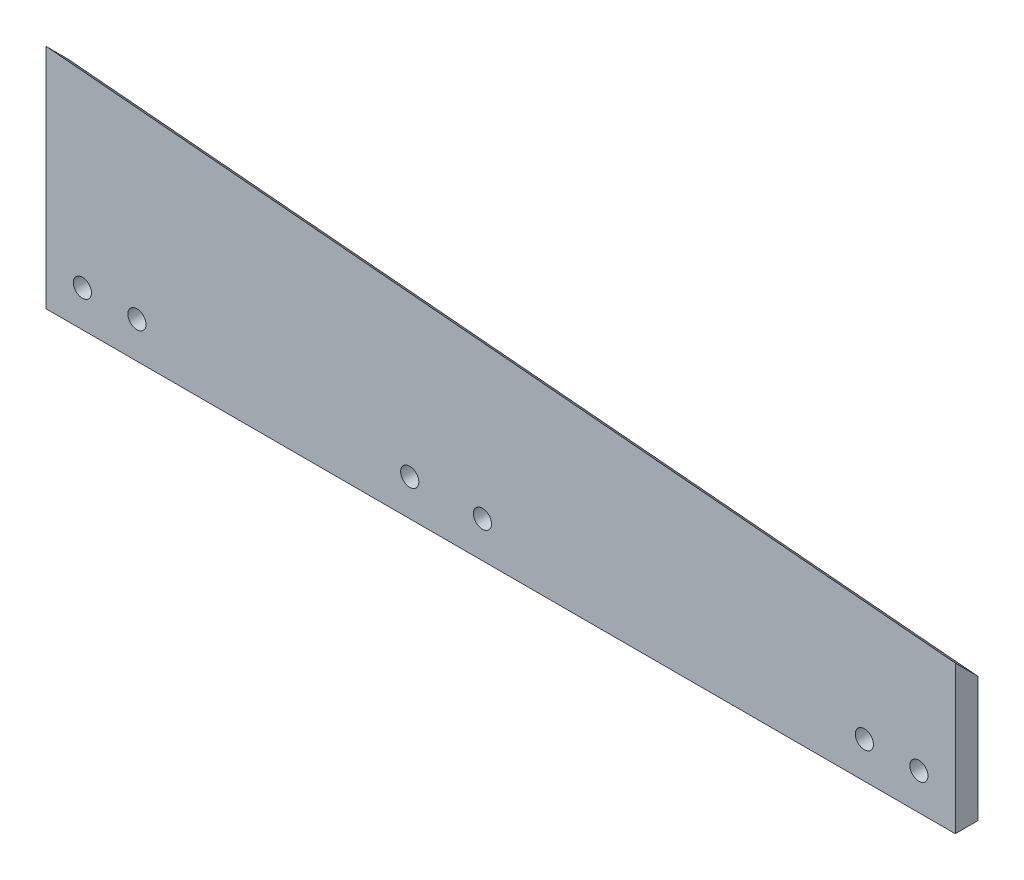
ISO-10303-21;
HEADER;
FILE_DESCRIPTION(('STEP AP214'),'2;1');
FILE_NAME('part.step','',(''),(''),'','','');
FILE_SCHEMA(('AUTOMOTIVE_DESIGN { 1 0 10303 214 1 1 1 1 }'));
ENDSEC;
DATA;
#1=APPLICATION_CONTEXT('core data for automotive mechanical design processes');
#2=APPLICATION_PROTOCOL_DEFINITION('international standard','automotive_design',2000,#1);
#3=PRODUCT_CONTEXT('',#1,'mechanical');
#4=PRODUCT('Part','Part','',(#3));
#5=PRODUCT_RELATED_PRODUCT_CATEGORY('part','',(#4));
#6=PRODUCT_DEFINITION_FORMATION('','',#4);
#7=PRODUCT_DEFINITION_CONTEXT('part definition',#1,'design');
#8=PRODUCT_DEFINITION('design','',#6,#7);
#9=PRODUCT_DEFINITION_SHAPE('','',#8);
#10=(LENGTH_UNIT() NAMED_UNIT(*) SI_UNIT(.MILLI.,.METRE.));
#11=(NAMED_UNIT(*) PLANE_ANGLE_UNIT() SI_UNIT($,.RADIAN.));
#12=(NAMED_UNIT(*) SI_UNIT($,.STERADIAN.) SOLID_ANGLE_UNIT());
#13=UNCERTAINTY_MEASURE_WITH_UNIT(LENGTH_MEASURE(1.E-05),#10,'distance_accuracy_value','');
#14=(GEOMETRIC_REPRESENTATION_CONTEXT(3) GLOBAL_UNCERTAINTY_ASSIGNED_CONTEXT((#13)) GLOBAL_UNIT_ASSIGNED_CONTEXT((#10,
#11,#12)) REPRESENTATION_CONTEXT('',''));
#15=CARTESIAN_POINT('',(0.,0.,0.));
#16=DIRECTION('',(0.,0.,1.));
#17=DIRECTION('',(1.,0.,0.));
#18=AXIS2_PLACEMENT_3D('',#15,#16,#17);
#19=CARTESIAN_POINT('',(200.,50.,5.));
#20=DIRECTION('',(0.,0.,-1.));
#21=DIRECTION('',(0.,1.,0.));
#22=AXIS2_PLACEMENT_3D('',#19,#20,#21);
#23=PLANE('',#22);
#24=CARTESIAN_POINT('',(80.,8.,5.));
#25=DIRECTION('',(0.,0.,-1.));
#26=DIRECTION('',(0.,1.,0.));
#27=AXIS2_PLACEMENT_3D('',#24,#25,#26);
#28=CIRCLE('',#27,2.);
#29=CARTESIAN_POINT('',(80.,10.,5.));
#30=VERTEX_POINT('',#29);
#31=EDGE_CURVE('E134',#30,#30,#28,.F.);
#32=ORIENTED_EDGE('',*,*,#31,.F.);
#33=EDGE_LOOP('',(#32));
#34=FACE_BOUND('',#33,.T.);
#35=CARTESIAN_POINT('',(96.,8.,5.));
#36=DIRECTION('',(0.,0.,-1.));
#37=DIRECTION('',(0.,1.,0.));
#38=AXIS2_PLACEMENT_3D('',#35,#36,#37);
#39=CIRCLE('',#38,2.);
#40=CARTESIAN_POINT('',(96.,10.,5.));
#41=VERTEX_POINT('',#40);
#42=EDGE_CURVE('E138',#41,#41,#39,.F.);
#43=ORIENTED_EDGE('',*,*,#42,.F.);
#44=EDGE_LOOP('',(#43));
#45=FACE_BOUND('',#44,.T.);
#46=CARTESIAN_POINT('',(8.00000000000001,8.,5.));
#47=DIRECTION('',(0.,0.,-1.));
#48=DIRECTION('',(0.,1.,0.));
#49=AXIS2_PLACEMENT_3D('',#46,#47,#48);
#50=CIRCLE('',#49,2.);
#51=CARTESIAN_POINT('',(8.00000000000001,10.,5.));
#52=VERTEX_POINT('',#51);
#53=EDGE_CURVE('E142',#52,#52,#50,.T.);
#54=ORIENTED_EDGE('',*,*,#53,.T.);
#55=EDGE_LOOP('',(#54));
#56=FACE_BOUND('',#55,.T.);
#57=CARTESIAN_POINT('',(20.,8.,5.));
#58=DIRECTION('',(0.,0.,-1.));
#59=DIRECTION('',(0.,1.,0.));
#60=AXIS2_PLACEMENT_3D('',#57,#58,#59);
#61=CIRCLE('',#60,2.);
#62=CARTESIAN_POINT('',(20.,10.,5.));
#63=VERTEX_POINT('',#62);
#64=EDGE_CURVE('E146',#63,#63,#61,.T.);
#65=ORIENTED_EDGE('',*,*,#64,.T.);
#66=EDGE_LOOP('',(#65));
#67=FACE_BOUND('',#66,.T.);
#68=CARTESIAN_POINT('',(192.,8.,5.));
#69=DIRECTION('',(0.,0.,-1.));
#70=DIRECTION('',(0.,1.,0.));
#71=AXIS2_PLACEMENT_3D('',#68,#69,#70);
#72=CIRCLE('',#71,2.);
#73=CARTESIAN_POINT('',(192.,10.,5.));
#74=VERTEX_POINT('',#73);
#75=EDGE_CURVE('E91',#74,#74,#72,.F.);
#76=ORIENTED_EDGE('',*,*,#75,.F.);
#77=EDGE_LOOP('',(#76));
#78=FACE_BOUND('',#77,.T.);
#79=CARTESIAN_POINT('',(180.,8.,5.));
#80=DIRECTION('',(0.,0.,-1.));
#81=DIRECTION('',(0.,1.,0.));
#82=AXIS2_PLACEMENT_3D('',#79,#80,#81);
#83=CIRCLE('',#82,2.);
#84=CARTESIAN_POINT('',(180.,10.,5.));
#85=VERTEX_POINT('',#84);
#86=EDGE_CURVE('E99',#85,#85,#83,.F.);
#87=ORIENTED_EDGE('',*,*,#86,.F.);
#88=EDGE_LOOP('',(#87));
#89=FACE_BOUND('',#88,.T.);
#90=DIRECTION('',(0.,-1.,0.));
#91=VECTOR('',#90,1.);
#92=CARTESIAN_POINT('',(200.,50.,5.));
#93=LINE('',#92,#91);
#94=CARTESIAN_POINT('',(200.,32.5022672948167,5.));
#95=VERTEX_POINT('',#94);
#96=CARTESIAN_POINT('',(200.,0.,5.));
#97=VERTEX_POINT('',#96);
#98=EDGE_CURVE('E75',#95,#97,#93,.T.);
#99=ORIENTED_EDGE('',*,*,#98,.F.);
#100=DIRECTION('',(0.996194698091746,-0.0871557427476508,0.));
#101=VECTOR('',#100,1.);
#102=CARTESIAN_POINT('',(200.,32.5022672948167,5.));
#103=LINE('',#102,#101);
#104=CARTESIAN_POINT('',(0.,50.,5.));
#105=VERTEX_POINT('',#104);
#106=EDGE_CURVE('E84',#105,#95,#103,.T.);
#107=ORIENTED_EDGE('',*,*,#106,.F.);
#108=DIRECTION('',(0.,-1.,0.));
#109=VECTOR('',#108,1.);
#110=CARTESIAN_POINT('',(0.,50.,5.));
#111=LINE('',#110,#109);
#112=CARTESIAN_POINT('',(0.,0.,5.));
#113=VERTEX_POINT('',#112);
#114=EDGE_CURVE('E90',#105,#113,#111,.T.);
#115=ORIENTED_EDGE('',*,*,#114,.T.);
#116=DIRECTION('',(-1.,0.,0.));
#117=VECTOR('',#116,1.);
#118=CARTESIAN_POINT('',(200.,0.,5.));
#119=LINE('',#118,#117);
#120=EDGE_CURVE('E86',#97,#113,#119,.T.);
#121=ORIENTED_EDGE('',*,*,#120,.F.);
#122=EDGE_LOOP('',(#99,#107,#115,#121));
#123=FACE_BOUND('',#122,.T.);
#124=ADVANCED_FACE('F33',(#34,#45,#56,#67,#78,#89,#123),#23,.F.);
#125=CARTESIAN_POINT('',(200.,0.,5.));
#126=DIRECTION('',(0.,1.,0.));
#127=DIRECTION('',(0.,0.,1.));
#128=AXIS2_PLACEMENT_3D('',#125,#126,#127);
#129=PLANE('',#128);
#130=DIRECTION('',(0.,0.,-1.));
#131=VECTOR('',#130,1.);
#132=CARTESIAN_POINT('',(0.,0.,5.));
#133=LINE('',#132,#131);
#134=CARTESIAN_POINT('',(0.,0.,0.));
#135=VERTEX_POINT('',#134);
#136=EDGE_CURVE('E93',#113,#135,#133,.T.);
#137=ORIENTED_EDGE('',*,*,#136,.T.);
#138=DIRECTION('',(-1.,0.,0.));
#139=VECTOR('',#138,1.);
#140=CARTESIAN_POINT('',(200.,0.,0.));
#141=LINE('',#140,#139);
#142=CARTESIAN_POINT('',(200.,0.,0.));
#143=VERTEX_POINT('',#142);
#144=EDGE_CURVE('E103',#143,#135,#141,.T.);
#145=ORIENTED_EDGE('',*,*,#144,.F.);
#146=DIRECTION('',(0.,0.,-1.));
#147=VECTOR('',#146,1.);
#148=CARTESIAN_POINT('',(200.,0.,5.));
#149=LINE('',#148,#147);
#150=EDGE_CURVE('E87',#97,#143,#149,.T.);
#151=ORIENTED_EDGE('',*,*,#150,.F.);
#152=ORIENTED_EDGE('',*,*,#120,.T.);
#153=EDGE_LOOP('',(#137,#145,#151,#152));
#154=FACE_BOUND('',#153,.T.);
#155=ADVANCED_FACE('F111',(#154),#129,.F.);
#156=CARTESIAN_POINT('',(200.,50.,0.));
#157=DIRECTION('',(0.,0.,1.));
#158=DIRECTION('',(0.,-1.,0.));
#159=AXIS2_PLACEMENT_3D('',#156,#157,#158);
#160=PLANE('',#159);
#161=CARTESIAN_POINT('',(80.,8.,0.));
#162=DIRECTION('',(0.,0.,-1.));
#163=DIRECTION('',(0.,1.,0.));
#164=AXIS2_PLACEMENT_3D('',#161,#162,#163);
#165=CIRCLE('',#164,2.);
#166=CARTESIAN_POINT('',(80.,10.,0.));
#167=VERTEX_POINT('',#166);
#168=EDGE_CURVE('E168',#167,#167,#165,.T.);
#169=ORIENTED_EDGE('',*,*,#168,.F.);
#170=EDGE_LOOP('',(#169));
#171=FACE_BOUND('',#170,.T.);
#172=CARTESIAN_POINT('',(96.,8.,0.));
#173=DIRECTION('',(0.,0.,-1.));
#174=DIRECTION('',(0.,1.,0.));
#175=AXIS2_PLACEMENT_3D('',#172,#173,#174);
#176=CIRCLE('',#175,2.);
#177=CARTESIAN_POINT('',(96.,10.,0.));
#178=VERTEX_POINT('',#177);
#179=EDGE_CURVE('E169',#178,#178,#176,.T.);
#180=ORIENTED_EDGE('',*,*,#179,.F.);
#181=EDGE_LOOP('',(#180));
#182=FACE_BOUND('',#181,.T.);
#183=CARTESIAN_POINT('',(8.00000000000001,8.,0.));
#184=DIRECTION('',(0.,0.,1.));
#185=DIRECTION('',(1.,0.,0.));
#186=AXIS2_PLACEMENT_3D('',#183,#184,#185);
#187=CIRCLE('',#186,2.);
#188=CARTESIAN_POINT('',(10.,8.,0.));
#189=VERTEX_POINT('',#188);
#190=EDGE_CURVE('E158',#189,#189,#187,.T.);
#191=ORIENTED_EDGE('',*,*,#190,.T.);
#192=EDGE_LOOP('',(#191));
#193=FACE_BOUND('',#192,.T.);
#194=CARTESIAN_POINT('',(20.,8.,0.));
#195=DIRECTION('',(0.,0.,1.));
#196=DIRECTION('',(1.,0.,0.));
#197=AXIS2_PLACEMENT_3D('',#194,#195,#196);
#198=CIRCLE('',#197,2.);
#199=CARTESIAN_POINT('',(22.,8.,0.));
#200=VERTEX_POINT('',#199);
#201=EDGE_CURVE('E162',#200,#200,#198,.T.);
#202=ORIENTED_EDGE('',*,*,#201,.T.);
#203=EDGE_LOOP('',(#202));
#204=FACE_BOUND('',#203,.T.);
#205=CARTESIAN_POINT('',(192.,8.,0.));
#206=DIRECTION('',(0.,0.,-1.));
#207=DIRECTION('',(-1.,0.,0.));
#208=AXIS2_PLACEMENT_3D('',#205,#206,#207);
#209=CIRCLE('',#208,2.);
#210=CARTESIAN_POINT('',(190.,8.,0.));
#211=VERTEX_POINT('',#210);
#212=EDGE_CURVE('E96',#211,#211,#209,.T.);
#213=ORIENTED_EDGE('',*,*,#212,.F.);
#214=EDGE_LOOP('',(#213));
#215=FACE_BOUND('',#214,.T.);
#216=CARTESIAN_POINT('',(180.,8.,0.));
#217=DIRECTION('',(0.,0.,-1.));
#218=DIRECTION('',(-1.,0.,0.));
#219=AXIS2_PLACEMENT_3D('',#216,#217,#218);
#220=CIRCLE('',#219,2.);
#221=CARTESIAN_POINT('',(178.,8.,0.));
#222=VERTEX_POINT('',#221);
#223=EDGE_CURVE('E152',#222,#222,#220,.T.);
#224=ORIENTED_EDGE('',*,*,#223,.F.);
#225=EDGE_LOOP('',(#224));
#226=FACE_BOUND('',#225,.T.);
#227=DIRECTION('',(0.,1.,0.));
#228=VECTOR('',#227,1.);
#229=CARTESIAN_POINT('',(0.,50.,0.));
#230=LINE('',#229,#228);
#231=CARTESIAN_POINT('',(0.,44.9809008122832,0.));
#232=VERTEX_POINT('',#231);
#233=EDGE_CURVE('E88',#135,#232,#230,.T.);
#234=ORIENTED_EDGE('',*,*,#233,.T.);
#235=DIRECTION('',(0.996194698091746,-0.0871557427476508,0.));
#236=VECTOR('',#235,1.);
#237=CARTESIAN_POINT('',(198.044996587483,27.6542087428497,0.));
#238=LINE('',#237,#236);
#239=CARTESIAN_POINT('',(200.,27.4831681070999,0.));
#240=VERTEX_POINT('',#239);
#241=EDGE_CURVE('E41',#232,#240,#238,.T.);
#242=ORIENTED_EDGE('',*,*,#241,.T.);
#243=DIRECTION('',(0.,1.,0.));
#244=VECTOR('',#243,1.);
#245=CARTESIAN_POINT('',(200.,50.,0.));
#246=LINE('',#245,#244);
#247=EDGE_CURVE('E77',#143,#240,#246,.T.);
#248=ORIENTED_EDGE('',*,*,#247,.F.);
#249=ORIENTED_EDGE('',*,*,#144,.T.);
#250=EDGE_LOOP('',(#234,#242,#248,#249));
#251=FACE_BOUND('',#250,.T.);
#252=ADVANCED_FACE('F114',(#171,#182,#193,#204,#215,#226,#251),#160,.F.);
#253=CARTESIAN_POINT('',(200.,0.,0.));
#254=DIRECTION('',(1.,0.,0.));
#255=DIRECTION('',(0.,0.,-1.));
#256=AXIS2_PLACEMENT_3D('',#253,#254,#255);
#257=PLANE('',#256);
#258=ORIENTED_EDGE('',*,*,#247,.T.);
#259=DIRECTION('',(0.,-0.708453436019949,-0.70575755680795));
#260=VECTOR('',#259,1.);
#261=CARTESIAN_POINT('',(200.,13.6891936869664,-13.7414841829501));
#262=LINE('',#261,#260);
#263=EDGE_CURVE('E11',#240,#95,#262,.F.);
#264=ORIENTED_EDGE('',*,*,#263,.T.);
#265=ORIENTED_EDGE('',*,*,#98,.T.);
#266=ORIENTED_EDGE('',*,*,#150,.T.);
#267=EDGE_LOOP('',(#258,#264,#265,#266));
#268=FACE_BOUND('',#267,.T.);
#269=ADVANCED_FACE('F74',(#268),#257,.T.);
#270=CARTESIAN_POINT('',(0.,0.,0.));
#271=DIRECTION('',(1.,0.,0.));
#272=DIRECTION('',(0.,0.,-1.));
#273=AXIS2_PLACEMENT_3D('',#270,#271,#272);
#274=PLANE('',#273);
#275=ORIENTED_EDGE('',*,*,#114,.F.);
#276=DIRECTION('',(0.,0.708453436019949,0.70575755680795));
#277=VECTOR('',#276,1.);
#278=CARTESIAN_POINT('',(0.,41.2177782268384,-3.74880276788938));
#279=LINE('',#278,#277);
#280=EDGE_CURVE('E55',#105,#232,#279,.F.);
#281=ORIENTED_EDGE('',*,*,#280,.T.);
#282=ORIENTED_EDGE('',*,*,#233,.F.);
#283=ORIENTED_EDGE('',*,*,#136,.F.);
#284=EDGE_LOOP('',(#275,#281,#282,#283));
#285=FACE_BOUND('',#284,.T.);
#286=ADVANCED_FACE('F113',(#285),#274,.F.);
#287=CARTESIAN_POINT('',(200.,32.5022672948167,5.));
#288=DIRECTION('',(-0.061628416716214,-0.704416026402757,0.707106781186549));
#289=DIRECTION('',(-0.996194698091746,0.0871557427476508,0.));
#290=AXIS2_PLACEMENT_3D('',#287,#288,#289);
#291=PLANE('',#290);
#292=ORIENTED_EDGE('',*,*,#263,.F.);
#293=ORIENTED_EDGE('',*,*,#241,.F.);
#294=ORIENTED_EDGE('',*,*,#280,.F.);
#295=ORIENTED_EDGE('',*,*,#106,.T.);
#296=EDGE_LOOP('',(#292,#293,#294,#295));
#297=FACE_BOUND('',#296,.T.);
#298=ADVANCED_FACE('F35',(#297),#291,.F.);
#299=CARTESIAN_POINT('',(180.,8.,10.6568542494924));
#300=DIRECTION('',(0.,0.,-1.));
#301=DIRECTION('',(-1.,0.,0.));
#302=AXIS2_PLACEMENT_3D('',#299,#300,#301);
#303=CYLINDRICAL_SURFACE('',#302,2.);
#304=ORIENTED_EDGE('',*,*,#86,.T.);
#305=EDGE_LOOP('',(#304));
#306=FACE_BOUND('',#305,.T.);
#307=ORIENTED_EDGE('',*,*,#223,.T.);
#308=EDGE_LOOP('',(#307));
#309=FACE_BOUND('',#308,.T.);
#310=ADVANCED_FACE('F197',(#306,#309),#303,.F.);
#311=CARTESIAN_POINT('',(192.,8.,10.6568542494924));
#312=DIRECTION('',(0.,0.,-1.));
#313=DIRECTION('',(-1.,0.,0.));
#314=AXIS2_PLACEMENT_3D('',#311,#312,#313);
#315=CYLINDRICAL_SURFACE('',#314,2.);
#316=ORIENTED_EDGE('',*,*,#75,.T.);
#317=EDGE_LOOP('',(#316));
#318=FACE_BOUND('',#317,.T.);
#319=ORIENTED_EDGE('',*,*,#212,.T.);
#320=EDGE_LOOP('',(#319));
#321=FACE_BOUND('',#320,.T.);
#322=ADVANCED_FACE('F193',(#318,#321),#315,.F.);
#323=CARTESIAN_POINT('',(20.,8.,10.6568542494924));
#324=DIRECTION('',(0.,0.,-1.));
#325=DIRECTION('',(-1.,0.,0.));
#326=AXIS2_PLACEMENT_3D('',#323,#324,#325);
#327=CYLINDRICAL_SURFACE('',#326,2.);
#328=ORIENTED_EDGE('',*,*,#64,.F.);
#329=EDGE_LOOP('',(#328));
#330=FACE_BOUND('',#329,.T.);
#331=ORIENTED_EDGE('',*,*,#201,.F.);
#332=EDGE_LOOP('',(#331));
#333=FACE_BOUND('',#332,.T.);
#334=ADVANCED_FACE('F189',(#330,#333),#327,.F.);
#335=CARTESIAN_POINT('',(8.00000000000001,8.,10.6568542494924));
#336=DIRECTION('',(0.,0.,-1.));
#337=DIRECTION('',(-1.,0.,0.));
#338=AXIS2_PLACEMENT_3D('',#335,#336,#337);
#339=CYLINDRICAL_SURFACE('',#338,2.);
#340=ORIENTED_EDGE('',*,*,#53,.F.);
#341=EDGE_LOOP('',(#340));
#342=FACE_BOUND('',#341,.T.);
#343=ORIENTED_EDGE('',*,*,#190,.F.);
#344=EDGE_LOOP('',(#343));
#345=FACE_BOUND('',#344,.T.);
#346=ADVANCED_FACE('F183',(#342,#345),#339,.F.);
#347=CARTESIAN_POINT('',(96.,8.,10.6568542494924));
#348=DIRECTION('',(0.,0.,-1.));
#349=DIRECTION('',(0.,1.,0.));
#350=AXIS2_PLACEMENT_3D('',#347,#348,#349);
#351=CYLINDRICAL_SURFACE('',#350,2.);
#352=ORIENTED_EDGE('',*,*,#42,.T.);
#353=EDGE_LOOP('',(#352));
#354=FACE_BOUND('',#353,.T.);
#355=ORIENTED_EDGE('',*,*,#179,.T.);
#356=EDGE_LOOP('',(#355));
#357=FACE_BOUND('',#356,.T.);
#358=ADVANCED_FACE('F177',(#354,#357),#351,.F.);
#359=CARTESIAN_POINT('',(80.,8.,10.6568542494924));
#360=DIRECTION('',(0.,0.,-1.));
#361=DIRECTION('',(0.,1.,0.));
#362=AXIS2_PLACEMENT_3D('',#359,#360,#361);
#363=CYLINDRICAL_SURFACE('',#362,2.);
#364=ORIENTED_EDGE('',*,*,#31,.T.);
#365=EDGE_LOOP('',(#364));
#366=FACE_BOUND('',#365,.T.);
#367=ORIENTED_EDGE('',*,*,#168,.T.);
#368=EDGE_LOOP('',(#367));
#369=FACE_BOUND('',#368,.T.);
#370=ADVANCED_FACE('F175',(#366,#369),#363,.F.);
#371=CLOSED_SHELL('',(#124,#155,#252,#269,#286,#298,#310,#322,#334,#346,#358,#370));
#372=MANIFOLD_SOLID_BREP('B2',#371);
#373=ADVANCED_BREP_SHAPE_REPRESENTATION('',(#18,#372),#14);
#374=SHAPE_DEFINITION_REPRESENTATION(#9,#373);
ENDSEC;
END-ISO-10303-21;
